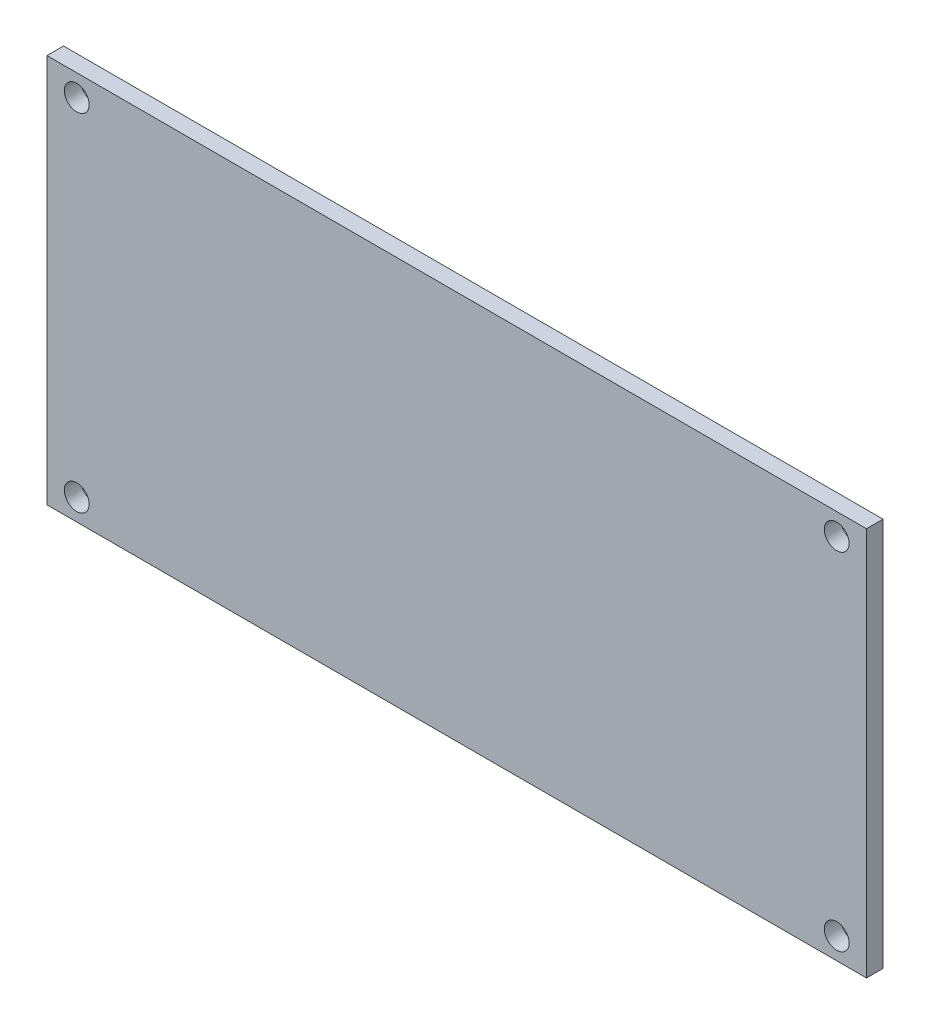
ISO-10303-21;
HEADER;
FILE_DESCRIPTION(('STEP AP214'),'2;1');
FILE_NAME('part.step','',(''),(''),'','','');
FILE_SCHEMA(('AUTOMOTIVE_DESIGN { 1 0 10303 214 1 1 1 1 }'));
ENDSEC;
DATA;
#1=APPLICATION_CONTEXT('core data for automotive mechanical design processes');
#2=APPLICATION_PROTOCOL_DEFINITION('international standard','automotive_design',2000,#1);
#3=PRODUCT_CONTEXT('',#1,'mechanical');
#4=PRODUCT('Part','Part','',(#3));
#5=PRODUCT_RELATED_PRODUCT_CATEGORY('part','',(#4));
#6=PRODUCT_DEFINITION_FORMATION('','',#4);
#7=PRODUCT_DEFINITION_CONTEXT('part definition',#1,'design');
#8=PRODUCT_DEFINITION('design','',#6,#7);
#9=PRODUCT_DEFINITION_SHAPE('','',#8);
#10=(LENGTH_UNIT() NAMED_UNIT(*) SI_UNIT(.MILLI.,.METRE.));
#11=(NAMED_UNIT(*) PLANE_ANGLE_UNIT() SI_UNIT($,.RADIAN.));
#12=(NAMED_UNIT(*) SI_UNIT($,.STERADIAN.) SOLID_ANGLE_UNIT());
#13=UNCERTAINTY_MEASURE_WITH_UNIT(LENGTH_MEASURE(1.E-05),#10,'distance_accuracy_value','');
#14=(GEOMETRIC_REPRESENTATION_CONTEXT(3) GLOBAL_UNCERTAINTY_ASSIGNED_CONTEXT((#13)) GLOBAL_UNIT_ASSIGNED_CONTEXT((#10,
#11,#12)) REPRESENTATION_CONTEXT('',''));
#15=CARTESIAN_POINT('',(0.,0.,0.));
#16=DIRECTION('',(0.,0.,1.));
#17=DIRECTION('',(1.,0.,0.));
#18=AXIS2_PLACEMENT_3D('',#15,#16,#17);
#19=CARTESIAN_POINT('',(0.,0.,2.));
#20=DIRECTION('',(0.,0.,1.));
#21=DIRECTION('',(1.,0.,0.));
#22=AXIS2_PLACEMENT_3D('',#19,#20,#21);
#23=PLANE('',#22);
#24=CARTESIAN_POINT('',(-45.9,-20.9,2.));
#25=DIRECTION('',(0.,0.,1.));
#26=DIRECTION('',(-1.,0.,0.));
#27=AXIS2_PLACEMENT_3D('',#24,#25,#26);
#28=CIRCLE('',#27,1.5);
#29=CARTESIAN_POINT('',(-47.4,-20.9,2.));
#30=VERTEX_POINT('',#29);
#31=EDGE_CURVE('E122',#30,#30,#28,.T.);
#32=ORIENTED_EDGE('',*,*,#31,.F.);
#33=EDGE_LOOP('',(#32));
#34=FACE_BOUND('',#33,.T.);
#35=CARTESIAN_POINT('',(-45.9,20.9,2.));
#36=DIRECTION('',(0.,0.,1.));
#37=DIRECTION('',(1.,0.,0.));
#38=AXIS2_PLACEMENT_3D('',#35,#36,#37);
#39=CIRCLE('',#38,1.5);
#40=CARTESIAN_POINT('',(-44.4,20.9,2.));
#41=VERTEX_POINT('',#40);
#42=EDGE_CURVE('E101',#41,#41,#39,.T.);
#43=ORIENTED_EDGE('',*,*,#42,.F.);
#44=EDGE_LOOP('',(#43));
#45=FACE_BOUND('',#44,.T.);
#46=DIRECTION('',(0.,1.,0.));
#47=VECTOR('',#46,1.);
#48=CARTESIAN_POINT('',(49.5,23.5,2.));
#49=LINE('',#48,#47);
#50=CARTESIAN_POINT('',(49.5,-23.5,2.));
#51=VERTEX_POINT('',#50);
#52=CARTESIAN_POINT('',(49.5,23.5,2.));
#53=VERTEX_POINT('',#52);
#54=EDGE_CURVE('E86',#51,#53,#49,.T.);
#55=ORIENTED_EDGE('',*,*,#54,.T.);
#56=DIRECTION('',(-1.,0.,0.));
#57=VECTOR('',#56,1.);
#58=CARTESIAN_POINT('',(-49.5,23.5,2.));
#59=LINE('',#58,#57);
#60=CARTESIAN_POINT('',(-49.5,23.5,2.));
#61=VERTEX_POINT('',#60);
#62=EDGE_CURVE('E81',#53,#61,#59,.T.);
#63=ORIENTED_EDGE('',*,*,#62,.T.);
#64=DIRECTION('',(0.,-1.,0.));
#65=VECTOR('',#64,1.);
#66=CARTESIAN_POINT('',(-49.5,23.5,2.));
#67=LINE('',#66,#65);
#68=CARTESIAN_POINT('',(-49.5,-23.5,2.));
#69=VERTEX_POINT('',#68);
#70=EDGE_CURVE('E84',#61,#69,#67,.T.);
#71=ORIENTED_EDGE('',*,*,#70,.T.);
#72=DIRECTION('',(1.,0.,0.));
#73=VECTOR('',#72,1.);
#74=CARTESIAN_POINT('',(-49.5,-23.5,2.));
#75=LINE('',#74,#73);
#76=EDGE_CURVE('E51',#69,#51,#75,.T.);
#77=ORIENTED_EDGE('',*,*,#76,.T.);
#78=EDGE_LOOP('',(#55,#63,#71,#77));
#79=FACE_BOUND('',#78,.T.);
#80=CARTESIAN_POINT('',(45.9,20.9,2.));
#81=DIRECTION('',(0.,0.,1.));
#82=DIRECTION('',(-1.,0.,0.));
#83=AXIS2_PLACEMENT_3D('',#80,#81,#82);
#84=CIRCLE('',#83,1.5);
#85=CARTESIAN_POINT('',(44.4,20.9,2.));
#86=VERTEX_POINT('',#85);
#87=EDGE_CURVE('E116',#86,#86,#84,.T.);
#88=ORIENTED_EDGE('',*,*,#87,.F.);
#89=EDGE_LOOP('',(#88));
#90=FACE_BOUND('',#89,.T.);
#91=CARTESIAN_POINT('',(45.9,-20.9,2.));
#92=DIRECTION('',(0.,0.,1.));
#93=DIRECTION('',(1.,0.,0.));
#94=AXIS2_PLACEMENT_3D('',#91,#92,#93);
#95=CIRCLE('',#94,1.5);
#96=CARTESIAN_POINT('',(47.4,-20.9,2.));
#97=VERTEX_POINT('',#96);
#98=EDGE_CURVE('E128',#97,#97,#95,.T.);
#99=ORIENTED_EDGE('',*,*,#98,.F.);
#100=EDGE_LOOP('',(#99));
#101=FACE_BOUND('',#100,.T.);
#102=ADVANCED_FACE('F34',(#34,#45,#79,#90,#101),#23,.T.);
#103=CARTESIAN_POINT('',(0.,0.,0.));
#104=DIRECTION('',(0.,0.,1.));
#105=DIRECTION('',(1.,0.,0.));
#106=AXIS2_PLACEMENT_3D('',#103,#104,#105);
#107=PLANE('',#106);
#108=DIRECTION('',(0.,1.,0.));
#109=VECTOR('',#108,1.);
#110=CARTESIAN_POINT('',(49.5,23.5,0.));
#111=LINE('',#110,#109);
#112=CARTESIAN_POINT('',(49.5,-23.5,0.));
#113=VERTEX_POINT('',#112);
#114=CARTESIAN_POINT('',(49.5,23.5,0.));
#115=VERTEX_POINT('',#114);
#116=EDGE_CURVE('E98',#113,#115,#111,.T.);
#117=ORIENTED_EDGE('',*,*,#116,.F.);
#118=DIRECTION('',(1.,0.,0.));
#119=VECTOR('',#118,1.);
#120=CARTESIAN_POINT('',(-49.5,-23.5,0.));
#121=LINE('',#120,#119);
#122=CARTESIAN_POINT('',(-49.5,-23.5,0.));
#123=VERTEX_POINT('',#122);
#124=EDGE_CURVE('E74',#123,#113,#121,.T.);
#125=ORIENTED_EDGE('',*,*,#124,.F.);
#126=DIRECTION('',(0.,-1.,0.));
#127=VECTOR('',#126,1.);
#128=CARTESIAN_POINT('',(-49.5,23.5,0.));
#129=LINE('',#128,#127);
#130=CARTESIAN_POINT('',(-49.5,23.5,0.));
#131=VERTEX_POINT('',#130);
#132=EDGE_CURVE('E68',#131,#123,#129,.T.);
#133=ORIENTED_EDGE('',*,*,#132,.F.);
#134=DIRECTION('',(-1.,0.,0.));
#135=VECTOR('',#134,1.);
#136=CARTESIAN_POINT('',(-49.5,23.5,0.));
#137=LINE('',#136,#135);
#138=EDGE_CURVE('E90',#115,#131,#137,.T.);
#139=ORIENTED_EDGE('',*,*,#138,.F.);
#140=EDGE_LOOP('',(#117,#125,#133,#139));
#141=FACE_BOUND('',#140,.T.);
#142=CARTESIAN_POINT('',(-45.9,20.9,0.));
#143=DIRECTION('',(0.,0.,1.));
#144=DIRECTION('',(1.,0.,0.));
#145=AXIS2_PLACEMENT_3D('',#142,#143,#144);
#146=CIRCLE('',#145,1.5);
#147=CARTESIAN_POINT('',(-44.4,20.9,0.));
#148=VERTEX_POINT('',#147);
#149=EDGE_CURVE('E113',#148,#148,#146,.T.);
#150=ORIENTED_EDGE('',*,*,#149,.T.);
#151=EDGE_LOOP('',(#150));
#152=FACE_BOUND('',#151,.T.);
#153=CARTESIAN_POINT('',(45.9,20.9,0.));
#154=DIRECTION('',(0.,0.,1.));
#155=DIRECTION('',(-1.,0.,0.));
#156=AXIS2_PLACEMENT_3D('',#153,#154,#155);
#157=CIRCLE('',#156,1.5);
#158=CARTESIAN_POINT('',(44.4,20.9,0.));
#159=VERTEX_POINT('',#158);
#160=EDGE_CURVE('E119',#159,#159,#157,.T.);
#161=ORIENTED_EDGE('',*,*,#160,.T.);
#162=EDGE_LOOP('',(#161));
#163=FACE_BOUND('',#162,.T.);
#164=CARTESIAN_POINT('',(-45.9,-20.9,0.));
#165=DIRECTION('',(0.,0.,1.));
#166=DIRECTION('',(-1.,0.,0.));
#167=AXIS2_PLACEMENT_3D('',#164,#165,#166);
#168=CIRCLE('',#167,1.5);
#169=CARTESIAN_POINT('',(-47.4,-20.9,0.));
#170=VERTEX_POINT('',#169);
#171=EDGE_CURVE('E125',#170,#170,#168,.T.);
#172=ORIENTED_EDGE('',*,*,#171,.T.);
#173=EDGE_LOOP('',(#172));
#174=FACE_BOUND('',#173,.T.);
#175=CARTESIAN_POINT('',(45.9,-20.9,0.));
#176=DIRECTION('',(0.,0.,1.));
#177=DIRECTION('',(1.,0.,0.));
#178=AXIS2_PLACEMENT_3D('',#175,#176,#177);
#179=CIRCLE('',#178,1.5);
#180=CARTESIAN_POINT('',(47.4,-20.9,0.));
#181=VERTEX_POINT('',#180);
#182=EDGE_CURVE('E131',#181,#181,#179,.T.);
#183=ORIENTED_EDGE('',*,*,#182,.T.);
#184=EDGE_LOOP('',(#183));
#185=FACE_BOUND('',#184,.T.);
#186=ADVANCED_FACE('F109',(#141,#152,#163,#174,#185),#107,.F.);
#187=CARTESIAN_POINT('',(49.5,23.5,2.));
#188=DIRECTION('',(-1.,0.,0.));
#189=DIRECTION('',(0.,-1.,0.));
#190=AXIS2_PLACEMENT_3D('',#187,#188,#189);
#191=PLANE('',#190);
#192=ORIENTED_EDGE('',*,*,#116,.T.);
#193=DIRECTION('',(0.,0.,-1.));
#194=VECTOR('',#193,1.);
#195=CARTESIAN_POINT('',(49.5,23.5,2.));
#196=LINE('',#195,#194);
#197=EDGE_CURVE('E11',#53,#115,#196,.T.);
#198=ORIENTED_EDGE('',*,*,#197,.F.);
#199=ORIENTED_EDGE('',*,*,#54,.F.);
#200=DIRECTION('',(0.,0.,-1.));
#201=VECTOR('',#200,1.);
#202=CARTESIAN_POINT('',(49.5,-23.5,2.));
#203=LINE('',#202,#201);
#204=EDGE_CURVE('E94',#51,#113,#203,.T.);
#205=ORIENTED_EDGE('',*,*,#204,.T.);
#206=EDGE_LOOP('',(#192,#198,#199,#205));
#207=FACE_BOUND('',#206,.T.);
#208=ADVANCED_FACE('F36',(#207),#191,.F.);
#209=CARTESIAN_POINT('',(-49.5,23.5,2.));
#210=DIRECTION('',(0.,-1.,0.));
#211=DIRECTION('',(0.,0.,-1.));
#212=AXIS2_PLACEMENT_3D('',#209,#210,#211);
#213=PLANE('',#212);
#214=ORIENTED_EDGE('',*,*,#138,.T.);
#215=DIRECTION('',(0.,0.,-1.));
#216=VECTOR('',#215,1.);
#217=CARTESIAN_POINT('',(-49.5,23.5,2.));
#218=LINE('',#217,#216);
#219=EDGE_CURVE('E43',#61,#131,#218,.T.);
#220=ORIENTED_EDGE('',*,*,#219,.F.);
#221=ORIENTED_EDGE('',*,*,#62,.F.);
#222=ORIENTED_EDGE('',*,*,#197,.T.);
#223=EDGE_LOOP('',(#214,#220,#221,#222));
#224=FACE_BOUND('',#223,.T.);
#225=ADVANCED_FACE('F89',(#224),#213,.F.);
#226=CARTESIAN_POINT('',(-49.5,23.5,2.));
#227=DIRECTION('',(1.,0.,0.));
#228=DIRECTION('',(0.,1.,0.));
#229=AXIS2_PLACEMENT_3D('',#226,#227,#228);
#230=PLANE('',#229);
#231=ORIENTED_EDGE('',*,*,#132,.T.);
#232=DIRECTION('',(0.,0.,-1.));
#233=VECTOR('',#232,1.);
#234=CARTESIAN_POINT('',(-49.5,-23.5,2.));
#235=LINE('',#234,#233);
#236=EDGE_CURVE('E91',#69,#123,#235,.T.);
#237=ORIENTED_EDGE('',*,*,#236,.F.);
#238=ORIENTED_EDGE('',*,*,#70,.F.);
#239=ORIENTED_EDGE('',*,*,#219,.T.);
#240=EDGE_LOOP('',(#231,#237,#238,#239));
#241=FACE_BOUND('',#240,.T.);
#242=ADVANCED_FACE('F92',(#241),#230,.F.);
#243=CARTESIAN_POINT('',(-49.5,-23.5,2.));
#244=DIRECTION('',(0.,1.,0.));
#245=DIRECTION('',(0.,0.,1.));
#246=AXIS2_PLACEMENT_3D('',#243,#244,#245);
#247=PLANE('',#246);
#248=ORIENTED_EDGE('',*,*,#124,.T.);
#249=ORIENTED_EDGE('',*,*,#204,.F.);
#250=ORIENTED_EDGE('',*,*,#76,.F.);
#251=ORIENTED_EDGE('',*,*,#236,.T.);
#252=EDGE_LOOP('',(#248,#249,#250,#251));
#253=FACE_BOUND('',#252,.T.);
#254=ADVANCED_FACE('F106',(#253),#247,.F.);
#255=CARTESIAN_POINT('',(-45.9,20.9,2.));
#256=DIRECTION('',(0.,0.,-1.));
#257=DIRECTION('',(-1.,0.,0.));
#258=AXIS2_PLACEMENT_3D('',#255,#256,#257);
#259=CYLINDRICAL_SURFACE('',#258,1.5);
#260=ORIENTED_EDGE('',*,*,#42,.T.);
#261=EDGE_LOOP('',(#260));
#262=FACE_BOUND('',#261,.T.);
#263=ORIENTED_EDGE('',*,*,#149,.F.);
#264=EDGE_LOOP('',(#263));
#265=FACE_BOUND('',#264,.T.);
#266=ADVANCED_FACE('F150',(#262,#265),#259,.F.);
#267=CARTESIAN_POINT('',(45.9,20.9,2.));
#268=DIRECTION('',(0.,0.,-1.));
#269=DIRECTION('',(-1.,0.,0.));
#270=AXIS2_PLACEMENT_3D('',#267,#268,#269);
#271=CYLINDRICAL_SURFACE('',#270,1.5);
#272=ORIENTED_EDGE('',*,*,#87,.T.);
#273=EDGE_LOOP('',(#272));
#274=FACE_BOUND('',#273,.T.);
#275=ORIENTED_EDGE('',*,*,#160,.F.);
#276=EDGE_LOOP('',(#275));
#277=FACE_BOUND('',#276,.T.);
#278=ADVANCED_FACE('F196',(#274,#277),#271,.F.);
#279=CARTESIAN_POINT('',(-45.9,-20.9,2.));
#280=DIRECTION('',(0.,0.,-1.));
#281=DIRECTION('',(-1.,0.,0.));
#282=AXIS2_PLACEMENT_3D('',#279,#280,#281);
#283=CYLINDRICAL_SURFACE('',#282,1.5);
#284=ORIENTED_EDGE('',*,*,#31,.T.);
#285=EDGE_LOOP('',(#284));
#286=FACE_BOUND('',#285,.T.);
#287=ORIENTED_EDGE('',*,*,#171,.F.);
#288=EDGE_LOOP('',(#287));
#289=FACE_BOUND('',#288,.T.);
#290=ADVANCED_FACE('F204',(#286,#289),#283,.F.);
#291=CARTESIAN_POINT('',(45.9,-20.9,2.));
#292=DIRECTION('',(0.,0.,-1.));
#293=DIRECTION('',(-1.,0.,0.));
#294=AXIS2_PLACEMENT_3D('',#291,#292,#293);
#295=CYLINDRICAL_SURFACE('',#294,1.5);
#296=ORIENTED_EDGE('',*,*,#98,.T.);
#297=EDGE_LOOP('',(#296));
#298=FACE_BOUND('',#297,.T.);
#299=ORIENTED_EDGE('',*,*,#182,.F.);
#300=EDGE_LOOP('',(#299));
#301=FACE_BOUND('',#300,.T.);
#302=ADVANCED_FACE('F137',(#298,#301),#295,.F.);
#303=CLOSED_SHELL('',(#102,#186,#208,#225,#242,#254,#266,#278,#290,#302));
#304=MANIFOLD_SOLID_BREP('B2',#303);
#305=ADVANCED_BREP_SHAPE_REPRESENTATION('',(#18,#304),#14);
#306=SHAPE_DEFINITION_REPRESENTATION(#9,#305);
ENDSEC;
END-ISO-10303-21;
